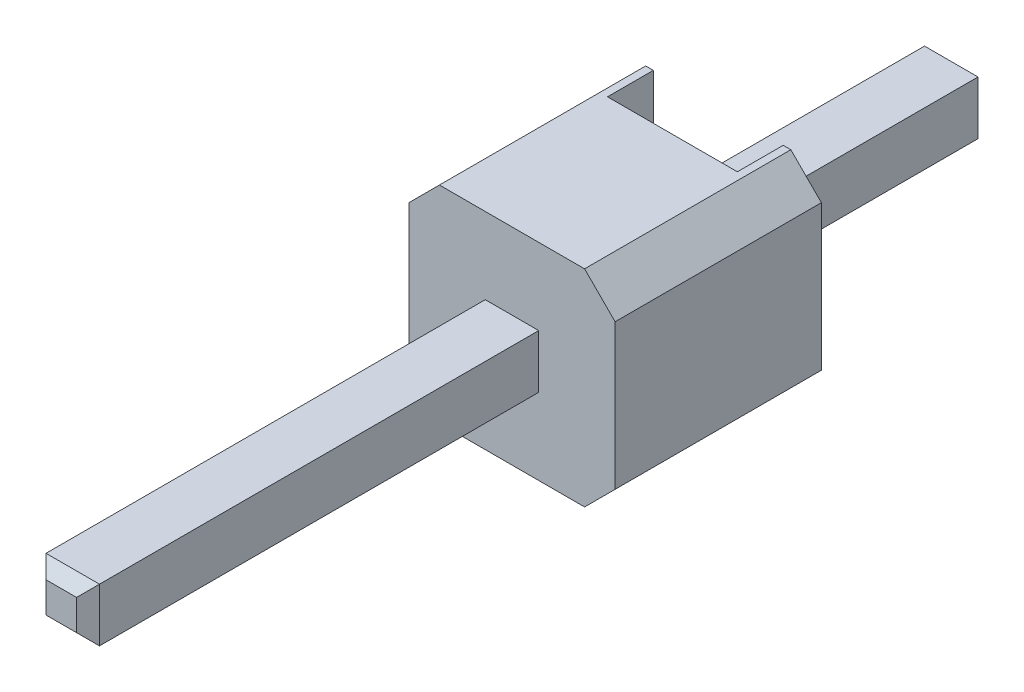
ISO-10303-21;
HEADER;
FILE_DESCRIPTION(('STEP AP214'),'2;1');
FILE_NAME('part.step','',(''),(''),'','','');
FILE_SCHEMA(('AUTOMOTIVE_DESIGN { 1 0 10303 214 1 1 1 1 }'));
ENDSEC;
DATA;
#1=APPLICATION_CONTEXT('core data for automotive mechanical design processes');
#2=APPLICATION_PROTOCOL_DEFINITION('international standard','automotive_design',2000,#1);
#3=PRODUCT_CONTEXT('',#1,'mechanical');
#4=PRODUCT('Part','Part','',(#3));
#5=PRODUCT_RELATED_PRODUCT_CATEGORY('part','',(#4));
#6=PRODUCT_DEFINITION_FORMATION('','',#4);
#7=PRODUCT_DEFINITION_CONTEXT('part definition',#1,'design');
#8=PRODUCT_DEFINITION('design','',#6,#7);
#9=PRODUCT_DEFINITION_SHAPE('','',#8);
#10=(LENGTH_UNIT() NAMED_UNIT(*) SI_UNIT(.MILLI.,.METRE.));
#11=(NAMED_UNIT(*) PLANE_ANGLE_UNIT() SI_UNIT($,.RADIAN.));
#12=(NAMED_UNIT(*) SI_UNIT($,.STERADIAN.) SOLID_ANGLE_UNIT());
#13=UNCERTAINTY_MEASURE_WITH_UNIT(LENGTH_MEASURE(1.E-05),#10,'distance_accuracy_value','');
#14=(GEOMETRIC_REPRESENTATION_CONTEXT(3) GLOBAL_UNCERTAINTY_ASSIGNED_CONTEXT((#13)) GLOBAL_UNIT_ASSIGNED_CONTEXT((#10,
#11,#12)) REPRESENTATION_CONTEXT('',''));
#15=CARTESIAN_POINT('',(0.,0.,0.));
#16=DIRECTION('',(0.,0.,1.));
#17=DIRECTION('',(1.,0.,0.));
#18=AXIS2_PLACEMENT_3D('',#15,#16,#17);
#19=CARTESIAN_POINT('',(-0.349999999999997,-0.35,-3.05));
#20=DIRECTION('',(0.,0.707106781186547,0.707106781186549));
#21=DIRECTION('',(0.,-0.707106781186549,0.707106781186547));
#22=AXIS2_PLACEMENT_3D('',#19,#20,#21);
#23=PLANE('',#22);
#24=DIRECTION('',(1.,0.,0.));
#25=VECTOR('',#24,1.);
#26=CARTESIAN_POINT('',(-0.349999999999997,-0.35,-3.05));
#27=LINE('',#26,#25);
#28=CARTESIAN_POINT('',(0.350000000000003,-0.35,-3.05));
#29=VERTEX_POINT('',#28);
#30=CARTESIAN_POINT('',(-0.349999999999997,-0.35,-3.05));
#31=VERTEX_POINT('',#30);
#32=EDGE_CURVE('E176',#29,#31,#27,.F.);
#33=ORIENTED_EDGE('',*,*,#32,.T.);
#34=DIRECTION('',(0.577350269189627,0.577350269189625,-0.577350269189625));
#35=VECTOR('',#34,1.);
#36=CARTESIAN_POINT('',(-0.349999999999997,-0.35,-3.05));
#37=LINE('',#36,#35);
#38=CARTESIAN_POINT('',(-0.199999999999997,-0.2,-3.2));
#39=VERTEX_POINT('',#38);
#40=EDGE_CURVE('E17',#31,#39,#37,.T.);
#41=ORIENTED_EDGE('',*,*,#40,.T.);
#42=DIRECTION('',(1.,0.,0.));
#43=VECTOR('',#42,1.);
#44=CARTESIAN_POINT('',(-0.349999999999997,-0.2,-3.2));
#45=LINE('',#44,#43);
#46=CARTESIAN_POINT('',(0.200000000000003,-0.2,-3.2));
#47=VERTEX_POINT('',#46);
#48=EDGE_CURVE('E171',#39,#47,#45,.T.);
#49=ORIENTED_EDGE('',*,*,#48,.T.);
#50=DIRECTION('',(0.577350269189627,-0.577350269189625,0.577350269189625));
#51=VECTOR('',#50,1.);
#52=CARTESIAN_POINT('',(0.200000000000003,-0.2,-3.2));
#53=LINE('',#52,#51);
#54=EDGE_CURVE('E192',#47,#29,#53,.T.);
#55=ORIENTED_EDGE('',*,*,#54,.T.);
#56=EDGE_LOOP('',(#33,#41,#49,#55));
#57=FACE_BOUND('',#56,.T.);
#58=ADVANCED_FACE('F14',(#57),#23,.F.);
#59=CARTESIAN_POINT('',(-0.349999999999997,0.35,-3.05));
#60=DIRECTION('',(0.707106781186546,0.,0.707106781186549));
#61=DIRECTION('',(0.707106781186549,0.,-0.707106781186546));
#62=AXIS2_PLACEMENT_3D('',#59,#60,#61);
#63=PLANE('',#62);
#64=DIRECTION('',(0.,1.,0.));
#65=VECTOR('',#64,1.);
#66=CARTESIAN_POINT('',(-0.199999999999997,0.35,-3.2));
#67=LINE('',#66,#65);
#68=CARTESIAN_POINT('',(-0.199999999999997,0.2,-3.2));
#69=VERTEX_POINT('',#68);
#70=EDGE_CURVE('E180',#69,#39,#67,.F.);
#71=ORIENTED_EDGE('',*,*,#70,.T.);
#72=ORIENTED_EDGE('',*,*,#40,.F.);
#73=DIRECTION('',(0.,1.,0.));
#74=VECTOR('',#73,1.);
#75=CARTESIAN_POINT('',(-0.349999999999997,0.35,-3.05));
#76=LINE('',#75,#74);
#77=CARTESIAN_POINT('',(-0.349999999999997,0.35,-3.05));
#78=VERTEX_POINT('',#77);
#79=EDGE_CURVE('E203',#31,#78,#76,.T.);
#80=ORIENTED_EDGE('',*,*,#79,.T.);
#81=DIRECTION('',(0.577350269189625,-0.577350269189627,-0.577350269189625));
#82=VECTOR('',#81,1.);
#83=CARTESIAN_POINT('',(-0.349999999999997,0.35,-3.05));
#84=LINE('',#83,#82);
#85=EDGE_CURVE('E184',#78,#69,#84,.T.);
#86=ORIENTED_EDGE('',*,*,#85,.T.);
#87=EDGE_LOOP('',(#71,#72,#80,#86));
#88=FACE_BOUND('',#87,.T.);
#89=ADVANCED_FACE('F182',(#88),#63,.F.);
#90=CARTESIAN_POINT('',(-0.349999999999997,0.35,-3.2));
#91=DIRECTION('',(0.,0.,1.));
#92=DIRECTION('',(1.,0.,0.));
#93=AXIS2_PLACEMENT_3D('',#90,#91,#92);
#94=PLANE('',#93);
#95=ORIENTED_EDGE('',*,*,#70,.F.);
#96=DIRECTION('',(1.,0.,0.));
#97=VECTOR('',#96,1.);
#98=CARTESIAN_POINT('',(-0.349999999999997,0.199999999999999,-3.2));
#99=LINE('',#98,#97);
#100=CARTESIAN_POINT('',(0.200000000000003,0.2,-3.2));
#101=VERTEX_POINT('',#100);
#102=EDGE_CURVE('E206',#69,#101,#99,.T.);
#103=ORIENTED_EDGE('',*,*,#102,.T.);
#104=DIRECTION('',(0.,1.,0.));
#105=VECTOR('',#104,1.);
#106=CARTESIAN_POINT('',(0.200000000000003,-0.35,-3.2));
#107=LINE('',#106,#105);
#108=EDGE_CURVE('E189',#101,#47,#107,.F.);
#109=ORIENTED_EDGE('',*,*,#108,.T.);
#110=ORIENTED_EDGE('',*,*,#48,.F.);
#111=EDGE_LOOP('',(#95,#103,#109,#110));
#112=FACE_BOUND('',#111,.T.);
#113=ADVANCED_FACE('F187',(#112),#94,.F.);
#114=CARTESIAN_POINT('',(0.350000000000003,-0.35,-3.05));
#115=DIRECTION('',(-0.707106781186547,0.,0.707106781186549));
#116=DIRECTION('',(0.707106781186549,0.,0.707106781186547));
#117=AXIS2_PLACEMENT_3D('',#114,#115,#116);
#118=PLANE('',#117);
#119=ORIENTED_EDGE('',*,*,#108,.F.);
#120=DIRECTION('',(0.577350269189625,0.577350269189627,0.577350269189625));
#121=VECTOR('',#120,1.);
#122=CARTESIAN_POINT('',(0.200000000000003,0.199999999999999,-3.2));
#123=LINE('',#122,#121);
#124=CARTESIAN_POINT('',(0.350000000000003,0.35,-3.05));
#125=VERTEX_POINT('',#124);
#126=EDGE_CURVE('E208',#101,#125,#123,.T.);
#127=ORIENTED_EDGE('',*,*,#126,.T.);
#128=DIRECTION('',(0.,1.,0.));
#129=VECTOR('',#128,1.);
#130=CARTESIAN_POINT('',(0.350000000000003,-0.35,-3.05));
#131=LINE('',#130,#129);
#132=EDGE_CURVE('E212',#125,#29,#131,.F.);
#133=ORIENTED_EDGE('',*,*,#132,.T.);
#134=ORIENTED_EDGE('',*,*,#54,.F.);
#135=EDGE_LOOP('',(#119,#127,#133,#134));
#136=FACE_BOUND('',#135,.T.);
#137=ADVANCED_FACE('F507',(#136),#118,.F.);
#138=CARTESIAN_POINT('',(-0.349999999999997,-0.35,8.6));
#139=DIRECTION('',(0.,1.,0.));
#140=DIRECTION('',(0.,0.,1.));
#141=AXIS2_PLACEMENT_3D('',#138,#139,#140);
#142=PLANE('',#141);
#143=ORIENTED_EDGE('',*,*,#32,.F.);
#144=DIRECTION('',(0.,0.,1.));
#145=VECTOR('',#144,1.);
#146=CARTESIAN_POINT('',(0.350000000000003,-0.35,8.6));
#147=LINE('',#146,#145);
#148=CARTESIAN_POINT('',(0.350000000000003,-0.35,0.6));
#149=VERTEX_POINT('',#148);
#150=EDGE_CURVE('E215',#29,#149,#147,.T.);
#151=ORIENTED_EDGE('',*,*,#150,.T.);
#152=DIRECTION('',(1.,0.,0.));
#153=VECTOR('',#152,1.);
#154=CARTESIAN_POINT('',(-0.349999999999997,-0.35,0.6));
#155=LINE('',#154,#153);
#156=CARTESIAN_POINT('',(-0.349999999999997,-0.35,0.6));
#157=VERTEX_POINT('',#156);
#158=EDGE_CURVE('E196',#157,#149,#155,.T.);
#159=ORIENTED_EDGE('',*,*,#158,.F.);
#160=DIRECTION('',(0.,0.,-1.));
#161=VECTOR('',#160,1.);
#162=CARTESIAN_POINT('',(-0.349999999999997,-0.35,8.6));
#163=LINE('',#162,#161);
#164=EDGE_CURVE('E201',#157,#31,#163,.T.);
#165=ORIENTED_EDGE('',*,*,#164,.T.);
#166=EDGE_LOOP('',(#143,#151,#159,#165));
#167=FACE_BOUND('',#166,.T.);
#168=ADVANCED_FACE('F503',(#167),#142,.F.);
#169=CARTESIAN_POINT('',(-0.349999999999997,0.35,8.6));
#170=DIRECTION('',(1.,0.,0.));
#171=DIRECTION('',(0.,0.,-1.));
#172=AXIS2_PLACEMENT_3D('',#169,#170,#171);
#173=PLANE('',#172);
#174=ORIENTED_EDGE('',*,*,#79,.F.);
#175=ORIENTED_EDGE('',*,*,#164,.F.);
#176=DIRECTION('',(0.,1.,0.));
#177=VECTOR('',#176,1.);
#178=CARTESIAN_POINT('',(-0.349999999999997,0.35,0.6));
#179=LINE('',#178,#177);
#180=CARTESIAN_POINT('',(-0.349999999999997,0.35,0.6));
#181=VERTEX_POINT('',#180);
#182=EDGE_CURVE('E199',#181,#157,#179,.F.);
#183=ORIENTED_EDGE('',*,*,#182,.F.);
#184=DIRECTION('',(0.,0.,-1.));
#185=VECTOR('',#184,1.);
#186=CARTESIAN_POINT('',(-0.349999999999997,0.35,8.6));
#187=LINE('',#186,#185);
#188=EDGE_CURVE('E218',#181,#78,#187,.T.);
#189=ORIENTED_EDGE('',*,*,#188,.T.);
#190=EDGE_LOOP('',(#174,#175,#183,#189));
#191=FACE_BOUND('',#190,.T.);
#192=ADVANCED_FACE('F499',(#191),#173,.F.);
#193=CARTESIAN_POINT('',(-0.349999999999997,0.35,-3.05));
#194=DIRECTION('',(0.,-0.707106781186546,0.707106781186549));
#195=DIRECTION('',(0.,-0.707106781186549,-0.707106781186546));
#196=AXIS2_PLACEMENT_3D('',#193,#194,#195);
#197=PLANE('',#196);
#198=ORIENTED_EDGE('',*,*,#102,.F.);
#199=ORIENTED_EDGE('',*,*,#85,.F.);
#200=DIRECTION('',(1.,0.,0.));
#201=VECTOR('',#200,1.);
#202=CARTESIAN_POINT('',(-0.349999999999997,0.35,-3.05));
#203=LINE('',#202,#201);
#204=EDGE_CURVE('E221',#78,#125,#203,.T.);
#205=ORIENTED_EDGE('',*,*,#204,.T.);
#206=ORIENTED_EDGE('',*,*,#126,.F.);
#207=EDGE_LOOP('',(#198,#199,#205,#206));
#208=FACE_BOUND('',#207,.T.);
#209=ADVANCED_FACE('F495',(#208),#197,.F.);
#210=CARTESIAN_POINT('',(0.350000000000003,-0.35,8.6));
#211=DIRECTION('',(-1.,0.,0.));
#212=DIRECTION('',(0.,0.,1.));
#213=AXIS2_PLACEMENT_3D('',#210,#211,#212);
#214=PLANE('',#213);
#215=ORIENTED_EDGE('',*,*,#132,.F.);
#216=DIRECTION('',(0.,0.,-1.));
#217=VECTOR('',#216,1.);
#218=CARTESIAN_POINT('',(0.350000000000003,0.35,8.6));
#219=LINE('',#218,#217);
#220=CARTESIAN_POINT('',(0.350000000000003,0.35,0.6));
#221=VERTEX_POINT('',#220);
#222=EDGE_CURVE('E224',#125,#221,#219,.F.);
#223=ORIENTED_EDGE('',*,*,#222,.T.);
#224=DIRECTION('',(0.,1.,0.));
#225=VECTOR('',#224,1.);
#226=CARTESIAN_POINT('',(0.350000000000003,-0.35,0.6));
#227=LINE('',#226,#225);
#228=EDGE_CURVE('E210',#149,#221,#227,.T.);
#229=ORIENTED_EDGE('',*,*,#228,.F.);
#230=ORIENTED_EDGE('',*,*,#150,.F.);
#231=EDGE_LOOP('',(#215,#223,#229,#230));
#232=FACE_BOUND('',#231,.T.);
#233=ADVANCED_FACE('F491',(#232),#214,.F.);
#234=CARTESIAN_POINT('',(-0.349999999999997,0.35,8.6));
#235=DIRECTION('',(0.,-1.,0.));
#236=DIRECTION('',(0.,0.,-1.));
#237=AXIS2_PLACEMENT_3D('',#234,#235,#236);
#238=PLANE('',#237);
#239=ORIENTED_EDGE('',*,*,#204,.F.);
#240=ORIENTED_EDGE('',*,*,#188,.F.);
#241=DIRECTION('',(1.,0.,0.));
#242=VECTOR('',#241,1.);
#243=CARTESIAN_POINT('',(0.850000000000004,0.35,0.6));
#244=LINE('',#243,#242);
#245=EDGE_CURVE('E231',#181,#221,#244,.T.);
#246=ORIENTED_EDGE('',*,*,#245,.T.);
#247=ORIENTED_EDGE('',*,*,#222,.F.);
#248=EDGE_LOOP('',(#239,#240,#246,#247));
#249=FACE_BOUND('',#248,.T.);
#250=ADVANCED_FACE('F484',(#249),#238,.F.);
#251=CARTESIAN_POINT('',(0.850000000000004,1.35,0.6));
#252=DIRECTION('',(0.,0.,1.));
#253=DIRECTION('',(1.,0.,0.));
#254=AXIS2_PLACEMENT_3D('',#251,#252,#253);
#255=PLANE('',#254);
#256=ORIENTED_EDGE('',*,*,#182,.T.);
#257=ORIENTED_EDGE('',*,*,#158,.T.);
#258=ORIENTED_EDGE('',*,*,#228,.T.);
#259=ORIENTED_EDGE('',*,*,#245,.F.);
#260=EDGE_LOOP('',(#256,#257,#258,#259));
#261=FACE_BOUND('',#260,.T.);
#262=DIRECTION('',(1.,0.,0.));
#263=VECTOR('',#262,1.);
#264=CARTESIAN_POINT('',(0.850000000000004,-1.35,0.6));
#265=LINE('',#264,#263);
#266=CARTESIAN_POINT('',(-0.849999999999997,-1.35,0.6));
#267=VERTEX_POINT('',#266);
#268=CARTESIAN_POINT('',(0.850000000000004,-1.35,0.6));
#269=VERTEX_POINT('',#268);
#270=EDGE_CURVE('E229',#267,#269,#265,.T.);
#271=ORIENTED_EDGE('',*,*,#270,.F.);
#272=DIRECTION('',(0.,1.,0.));
#273=VECTOR('',#272,1.);
#274=CARTESIAN_POINT('',(-0.849999999999997,1.35,0.6));
#275=LINE('',#274,#273);
#276=CARTESIAN_POINT('',(-0.849999999999997,1.35,0.6));
#277=VERTEX_POINT('',#276);
#278=EDGE_CURVE('E246',#277,#267,#275,.F.);
#279=ORIENTED_EDGE('',*,*,#278,.F.);
#280=DIRECTION('',(1.,0.,0.));
#281=VECTOR('',#280,1.);
#282=CARTESIAN_POINT('',(0.850000000000004,1.35,0.6));
#283=LINE('',#282,#281);
#284=CARTESIAN_POINT('',(0.850000000000004,1.35,0.6));
#285=VERTEX_POINT('',#284);
#286=EDGE_CURVE('E227',#285,#277,#283,.F.);
#287=ORIENTED_EDGE('',*,*,#286,.F.);
#288=DIRECTION('',(0.,1.,0.));
#289=VECTOR('',#288,1.);
#290=CARTESIAN_POINT('',(0.850000000000004,1.35,0.6));
#291=LINE('',#290,#289);
#292=EDGE_CURVE('E237',#269,#285,#291,.T.);
#293=ORIENTED_EDGE('',*,*,#292,.F.);
#294=EDGE_LOOP('',(#271,#279,#287,#293));
#295=FACE_BOUND('',#294,.T.);
#296=ADVANCED_FACE('F475',(#261,#295),#255,.F.);
#297=CARTESIAN_POINT('',(-0.349999999999997,0.2,8.6));
#298=DIRECTION('',(0.,0.707106781186549,0.707106781186546));
#299=DIRECTION('',(0.,-0.707106781186546,0.707106781186549));
#300=AXIS2_PLACEMENT_3D('',#297,#298,#299);
#301=PLANE('',#300);
#302=DIRECTION('',(-0.577350269189625,0.577350269189625,-0.577350269189628));
#303=VECTOR('',#302,1.);
#304=CARTESIAN_POINT('',(-0.199999999999997,0.2,8.6));
#305=LINE('',#304,#303);
#306=CARTESIAN_POINT('',(-0.199999999999997,0.2,8.6));
#307=VERTEX_POINT('',#306);
#308=CARTESIAN_POINT('',(-0.349999999999997,0.35,8.45));
#309=VERTEX_POINT('',#308);
#310=EDGE_CURVE('E251',#307,#309,#305,.T.);
#311=ORIENTED_EDGE('',*,*,#310,.F.);
#312=DIRECTION('',(1.,0.,0.));
#313=VECTOR('',#312,1.);
#314=CARTESIAN_POINT('',(-0.349999999999997,0.2,8.6));
#315=LINE('',#314,#313);
#316=CARTESIAN_POINT('',(0.200000000000003,0.2,8.6));
#317=VERTEX_POINT('',#316);
#318=EDGE_CURVE('E257',#317,#307,#315,.F.);
#319=ORIENTED_EDGE('',*,*,#318,.F.);
#320=DIRECTION('',(-0.577350269189624,-0.577350269189625,0.577350269189628));
#321=VECTOR('',#320,1.);
#322=CARTESIAN_POINT('',(0.350000000000003,0.35,8.45));
#323=LINE('',#322,#321);
#324=CARTESIAN_POINT('',(0.350000000000003,0.35,8.45));
#325=VERTEX_POINT('',#324);
#326=EDGE_CURVE('E260',#325,#317,#323,.T.);
#327=ORIENTED_EDGE('',*,*,#326,.F.);
#328=DIRECTION('',(1.,0.,0.));
#329=VECTOR('',#328,1.);
#330=CARTESIAN_POINT('',(-0.349999999999997,0.35,8.45));
#331=LINE('',#330,#329);
#332=EDGE_CURVE('E267',#325,#309,#331,.F.);
#333=ORIENTED_EDGE('',*,*,#332,.T.);
#334=EDGE_LOOP('',(#311,#319,#327,#333));
#335=FACE_BOUND('',#334,.T.);
#336=ADVANCED_FACE('F472',(#335),#301,.T.);
#337=CARTESIAN_POINT('',(0.850000000000004,1.35,0.6));
#338=DIRECTION('',(-1.,0.,0.));
#339=DIRECTION('',(0.,0.,1.));
#340=AXIS2_PLACEMENT_3D('',#337,#338,#339);
#341=PLANE('',#340);
#342=ORIENTED_EDGE('',*,*,#292,.T.);
#343=DIRECTION('',(0.,0.,1.));
#344=VECTOR('',#343,1.);
#345=CARTESIAN_POINT('',(0.850000000000004,1.35,0.6));
#346=LINE('',#345,#344);
#347=CARTESIAN_POINT('',(0.850000000000003,1.35,0.));
#348=VERTEX_POINT('',#347);
#349=EDGE_CURVE('E240',#285,#348,#346,.F.);
#350=ORIENTED_EDGE('',*,*,#349,.T.);
#351=DIRECTION('',(0.,1.,0.));
#352=VECTOR('',#351,1.);
#353=CARTESIAN_POINT('',(0.850000000000003,1.35,0.));
#354=LINE('',#353,#352);
#355=CARTESIAN_POINT('',(0.850000000000004,-1.35,0.));
#356=VERTEX_POINT('',#355);
#357=EDGE_CURVE('E271',#348,#356,#354,.F.);
#358=ORIENTED_EDGE('',*,*,#357,.T.);
#359=DIRECTION('',(0.,0.,1.));
#360=VECTOR('',#359,1.);
#361=CARTESIAN_POINT('',(0.850000000000004,-1.35,0.6));
#362=LINE('',#361,#360);
#363=EDGE_CURVE('E234',#356,#269,#362,.T.);
#364=ORIENTED_EDGE('',*,*,#363,.T.);
#365=EDGE_LOOP('',(#342,#350,#358,#364));
#366=FACE_BOUND('',#365,.T.);
#367=ADVANCED_FACE('F474',(#366),#341,.T.);
#368=CARTESIAN_POINT('',(-0.849999999999997,1.35,0.6));
#369=DIRECTION('',(1.,0.,0.));
#370=DIRECTION('',(0.,0.,-1.));
#371=AXIS2_PLACEMENT_3D('',#368,#369,#370);
#372=PLANE('',#371);
#373=ORIENTED_EDGE('',*,*,#278,.T.);
#374=DIRECTION('',(0.,0.,-1.));
#375=VECTOR('',#374,1.);
#376=CARTESIAN_POINT('',(-0.849999999999997,-1.35,0.6));
#377=LINE('',#376,#375);
#378=CARTESIAN_POINT('',(-0.849999999999997,-1.35,0.));
#379=VERTEX_POINT('',#378);
#380=EDGE_CURVE('E249',#267,#379,#377,.T.);
#381=ORIENTED_EDGE('',*,*,#380,.T.);
#382=DIRECTION('',(0.,1.,0.));
#383=VECTOR('',#382,1.);
#384=CARTESIAN_POINT('',(-0.849999999999997,1.35,0.));
#385=LINE('',#384,#383);
#386=CARTESIAN_POINT('',(-0.849999999999997,1.35,0.));
#387=VERTEX_POINT('',#386);
#388=EDGE_CURVE('E286',#379,#387,#385,.T.);
#389=ORIENTED_EDGE('',*,*,#388,.T.);
#390=DIRECTION('',(0.,0.,-1.));
#391=VECTOR('',#390,1.);
#392=CARTESIAN_POINT('',(-0.849999999999997,1.35,0.6));
#393=LINE('',#392,#391);
#394=EDGE_CURVE('E243',#387,#277,#393,.F.);
#395=ORIENTED_EDGE('',*,*,#394,.T.);
#396=EDGE_LOOP('',(#373,#381,#389,#395));
#397=FACE_BOUND('',#396,.T.);
#398=ADVANCED_FACE('F481',(#397),#372,.T.);
#399=CARTESIAN_POINT('',(-0.199999999999997,0.35,8.6));
#400=DIRECTION('',(-0.707106781186549,0.,0.707106781186546));
#401=DIRECTION('',(0.707106781186546,0.,0.707106781186549));
#402=AXIS2_PLACEMENT_3D('',#399,#400,#401);
#403=PLANE('',#402);
#404=DIRECTION('',(-0.577350269189625,-0.577350269189624,-0.577350269189628));
#405=VECTOR('',#404,1.);
#406=CARTESIAN_POINT('',(-0.199999999999997,-0.2,8.6));
#407=LINE('',#406,#405);
#408=CARTESIAN_POINT('',(-0.199999999999997,-0.2,8.6));
#409=VERTEX_POINT('',#408);
#410=CARTESIAN_POINT('',(-0.349999999999997,-0.35,8.45));
#411=VERTEX_POINT('',#410);
#412=EDGE_CURVE('E300',#409,#411,#407,.T.);
#413=ORIENTED_EDGE('',*,*,#412,.F.);
#414=DIRECTION('',(0.,1.,0.));
#415=VECTOR('',#414,1.);
#416=CARTESIAN_POINT('',(-0.199999999999997,0.35,8.6));
#417=LINE('',#416,#415);
#418=EDGE_CURVE('E254',#307,#409,#417,.F.);
#419=ORIENTED_EDGE('',*,*,#418,.F.);
#420=ORIENTED_EDGE('',*,*,#310,.T.);
#421=DIRECTION('',(0.,1.,0.));
#422=VECTOR('',#421,1.);
#423=CARTESIAN_POINT('',(-0.349999999999997,0.35,8.45));
#424=LINE('',#423,#422);
#425=EDGE_CURVE('E298',#309,#411,#424,.F.);
#426=ORIENTED_EDGE('',*,*,#425,.T.);
#427=EDGE_LOOP('',(#413,#419,#420,#426));
#428=FACE_BOUND('',#427,.T.);
#429=ADVANCED_FACE('F461',(#428),#403,.T.);
#430=CARTESIAN_POINT('',(-0.349999999999997,0.35,8.6));
#431=DIRECTION('',(0.,0.,1.));
#432=DIRECTION('',(1.,0.,0.));
#433=AXIS2_PLACEMENT_3D('',#430,#431,#432);
#434=PLANE('',#433);
#435=DIRECTION('',(0.,1.,0.));
#436=VECTOR('',#435,1.);
#437=CARTESIAN_POINT('',(0.200000000000003,0.35,8.6));
#438=LINE('',#437,#436);
#439=CARTESIAN_POINT('',(0.200000000000003,-0.2,8.6));
#440=VERTEX_POINT('',#439);
#441=EDGE_CURVE('E263',#317,#440,#438,.F.);
#442=ORIENTED_EDGE('',*,*,#441,.F.);
#443=ORIENTED_EDGE('',*,*,#318,.T.);
#444=ORIENTED_EDGE('',*,*,#418,.T.);
#445=DIRECTION('',(1.,0.,0.));
#446=VECTOR('',#445,1.);
#447=CARTESIAN_POINT('',(-0.349999999999997,-0.2,8.6));
#448=LINE('',#447,#446);
#449=EDGE_CURVE('E306',#440,#409,#448,.F.);
#450=ORIENTED_EDGE('',*,*,#449,.F.);
#451=EDGE_LOOP('',(#442,#443,#444,#450));
#452=FACE_BOUND('',#451,.T.);
#453=ADVANCED_FACE('F458',(#452),#434,.T.);
#454=CARTESIAN_POINT('',(0.200000000000003,0.35,8.6));
#455=DIRECTION('',(0.70710678118655,0.,0.707106781186545));
#456=DIRECTION('',(0.707106781186545,0.,-0.70710678118655));
#457=AXIS2_PLACEMENT_3D('',#454,#455,#456);
#458=PLANE('',#457);
#459=DIRECTION('',(-0.577350269189625,0.577350269189624,0.577350269189628));
#460=VECTOR('',#459,1.);
#461=CARTESIAN_POINT('',(0.350000000000003,-0.35,8.45));
#462=LINE('',#461,#460);
#463=CARTESIAN_POINT('',(0.350000000000003,-0.35,8.45));
#464=VERTEX_POINT('',#463);
#465=EDGE_CURVE('E303',#464,#440,#462,.T.);
#466=ORIENTED_EDGE('',*,*,#465,.F.);
#467=DIRECTION('',(0.,1.,0.));
#468=VECTOR('',#467,1.);
#469=CARTESIAN_POINT('',(0.350000000000003,-0.35,8.45));
#470=LINE('',#469,#468);
#471=EDGE_CURVE('E310',#464,#325,#470,.T.);
#472=ORIENTED_EDGE('',*,*,#471,.T.);
#473=ORIENTED_EDGE('',*,*,#326,.T.);
#474=ORIENTED_EDGE('',*,*,#441,.T.);
#475=EDGE_LOOP('',(#466,#472,#473,#474));
#476=FACE_BOUND('',#475,.T.);
#477=ADVANCED_FACE('F454',(#476),#458,.T.);
#478=CARTESIAN_POINT('',(-0.349999999999997,0.35,8.6));
#479=DIRECTION('',(0.,-1.,0.));
#480=DIRECTION('',(0.,0.,-1.));
#481=AXIS2_PLACEMENT_3D('',#478,#479,#480);
#482=PLANE('',#481);
#483=ORIENTED_EDGE('',*,*,#332,.F.);
#484=DIRECTION('',(0.,0.,1.));
#485=VECTOR('',#484,1.);
#486=CARTESIAN_POINT('',(0.350000000000003,0.35,8.6));
#487=LINE('',#486,#485);
#488=CARTESIAN_POINT('',(0.350000000000003,0.35,2.7));
#489=VERTEX_POINT('',#488);
#490=EDGE_CURVE('E313',#325,#489,#487,.F.);
#491=ORIENTED_EDGE('',*,*,#490,.T.);
#492=DIRECTION('',(1.,0.,0.));
#493=VECTOR('',#492,1.);
#494=CARTESIAN_POINT('',(-0.349999999999997,0.35,2.7));
#495=LINE('',#494,#493);
#496=CARTESIAN_POINT('',(-0.349999999999997,0.35,2.7));
#497=VERTEX_POINT('',#496);
#498=EDGE_CURVE('E265',#497,#489,#495,.T.);
#499=ORIENTED_EDGE('',*,*,#498,.F.);
#500=DIRECTION('',(0.,0.,-1.));
#501=VECTOR('',#500,1.);
#502=CARTESIAN_POINT('',(-0.349999999999997,0.35,8.6));
#503=LINE('',#502,#501);
#504=EDGE_CURVE('E295',#497,#309,#503,.F.);
#505=ORIENTED_EDGE('',*,*,#504,.T.);
#506=EDGE_LOOP('',(#483,#491,#499,#505));
#507=FACE_BOUND('',#506,.T.);
#508=ADVANCED_FACE('F469',(#507),#482,.F.);
#509=CARTESIAN_POINT('',(1.35,1.35,0.));
#510=DIRECTION('',(0.,0.,1.));
#511=DIRECTION('',(1.,0.,0.));
#512=AXIS2_PLACEMENT_3D('',#509,#510,#511);
#513=PLANE('',#512);
#514=DIRECTION('',(-0.707106781186548,-0.707106781186548,0.));
#515=VECTOR('',#514,1.);
#516=CARTESIAN_POINT('',(1.35,-0.95,0.));
#517=LINE('',#516,#515);
#518=CARTESIAN_POINT('',(1.35,-0.949999999999999,0.));
#519=VERTEX_POINT('',#518);
#520=CARTESIAN_POINT('',(0.950000000000002,-1.35,0.));
#521=VERTEX_POINT('',#520);
#522=EDGE_CURVE('E274',#519,#521,#517,.T.);
#523=ORIENTED_EDGE('',*,*,#522,.T.);
#524=DIRECTION('',(1.,0.,0.));
#525=VECTOR('',#524,1.);
#526=CARTESIAN_POINT('',(-1.35,-1.35,0.));
#527=LINE('',#526,#525);
#528=EDGE_CURVE('E325',#521,#356,#527,.F.);
#529=ORIENTED_EDGE('',*,*,#528,.T.);
#530=ORIENTED_EDGE('',*,*,#357,.F.);
#531=DIRECTION('',(1.,0.,0.));
#532=VECTOR('',#531,1.);
#533=CARTESIAN_POINT('',(1.35,1.35,0.));
#534=LINE('',#533,#532);
#535=CARTESIAN_POINT('',(0.950000000000004,1.35,0.));
#536=VERTEX_POINT('',#535);
#537=EDGE_CURVE('E269',#536,#348,#534,.F.);
#538=ORIENTED_EDGE('',*,*,#537,.F.);
#539=DIRECTION('',(0.707106781186548,-0.707106781186548,0.));
#540=VECTOR('',#539,1.);
#541=CARTESIAN_POINT('',(0.950000000000004,1.35,0.));
#542=LINE('',#541,#540);
#543=CARTESIAN_POINT('',(1.35,0.950000000000001,0.));
#544=VERTEX_POINT('',#543);
#545=EDGE_CURVE('E278',#536,#544,#542,.T.);
#546=ORIENTED_EDGE('',*,*,#545,.T.);
#547=DIRECTION('',(0.,1.,0.));
#548=VECTOR('',#547,1.);
#549=CARTESIAN_POINT('',(1.35,1.35,0.));
#550=LINE('',#549,#548);
#551=EDGE_CURVE('E331',#544,#519,#550,.F.);
#552=ORIENTED_EDGE('',*,*,#551,.T.);
#553=EDGE_LOOP('',(#523,#529,#530,#538,#546,#552));
#554=FACE_BOUND('',#553,.T.);
#555=ADVANCED_FACE('F627',(#554),#513,.F.);
#556=CARTESIAN_POINT('',(1.35,-0.95,2.7));
#557=DIRECTION('',(-0.707106781186548,0.707106781186548,0.));
#558=DIRECTION('',(-0.707106781186548,-0.707106781186548,0.));
#559=AXIS2_PLACEMENT_3D('',#556,#557,#558);
#560=PLANE('',#559);
#561=DIRECTION('',(0.,0.,1.));
#562=VECTOR('',#561,1.);
#563=CARTESIAN_POINT('',(0.950000000000002,-1.35,2.7));
#564=LINE('',#563,#562);
#565=CARTESIAN_POINT('',(0.950000000000002,-1.35,2.7));
#566=VERTEX_POINT('',#565);
#567=EDGE_CURVE('E322',#566,#521,#564,.F.);
#568=ORIENTED_EDGE('',*,*,#567,.T.);
#569=ORIENTED_EDGE('',*,*,#522,.F.);
#570=DIRECTION('',(0.,0.,1.));
#571=VECTOR('',#570,1.);
#572=CARTESIAN_POINT('',(1.35,-0.949999999999999,2.7));
#573=LINE('',#572,#571);
#574=CARTESIAN_POINT('',(1.35,-0.949999999999999,2.7));
#575=VERTEX_POINT('',#574);
#576=EDGE_CURVE('E333',#519,#575,#573,.T.);
#577=ORIENTED_EDGE('',*,*,#576,.T.);
#578=DIRECTION('',(-0.707106781186548,-0.707106781186548,0.));
#579=VECTOR('',#578,1.);
#580=CARTESIAN_POINT('',(1.35,-0.95,2.7));
#581=LINE('',#580,#579);
#582=EDGE_CURVE('E276',#566,#575,#581,.F.);
#583=ORIENTED_EDGE('',*,*,#582,.F.);
#584=EDGE_LOOP('',(#568,#569,#577,#583));
#585=FACE_BOUND('',#584,.T.);
#586=ADVANCED_FACE('F397',(#585),#560,.F.);
#587=CARTESIAN_POINT('',(0.950000000000004,1.35,2.7));
#588=DIRECTION('',(-0.707106781186548,-0.707106781186548,0.));
#589=DIRECTION('',(0.707106781186548,-0.707106781186548,0.));
#590=AXIS2_PLACEMENT_3D('',#587,#588,#589);
#591=PLANE('',#590);
#592=DIRECTION('',(0.,0.,1.));
#593=VECTOR('',#592,1.);
#594=CARTESIAN_POINT('',(1.35,0.95,2.7));
#595=LINE('',#594,#593);
#596=CARTESIAN_POINT('',(1.35,0.950000000000001,2.7));
#597=VERTEX_POINT('',#596);
#598=EDGE_CURVE('E328',#597,#544,#595,.F.);
#599=ORIENTED_EDGE('',*,*,#598,.T.);
#600=ORIENTED_EDGE('',*,*,#545,.F.);
#601=DIRECTION('',(0.,0.,-1.));
#602=VECTOR('',#601,1.);
#603=CARTESIAN_POINT('',(0.950000000000004,1.35,2.7));
#604=LINE('',#603,#602);
#605=CARTESIAN_POINT('',(0.950000000000004,1.35,2.7));
#606=VERTEX_POINT('',#605);
#607=EDGE_CURVE('E342',#536,#606,#604,.F.);
#608=ORIENTED_EDGE('',*,*,#607,.T.);
#609=DIRECTION('',(0.707106781186548,-0.707106781186548,0.));
#610=VECTOR('',#609,1.);
#611=CARTESIAN_POINT('',(0.950000000000004,1.35,2.7));
#612=LINE('',#611,#610);
#613=EDGE_CURVE('E280',#597,#606,#612,.F.);
#614=ORIENTED_EDGE('',*,*,#613,.F.);
#615=EDGE_LOOP('',(#599,#600,#608,#614));
#616=FACE_BOUND('',#615,.T.);
#617=ADVANCED_FACE('F404',(#616),#591,.F.);
#618=CARTESIAN_POINT('',(-0.949999999999996,-1.35,2.7));
#619=DIRECTION('',(0.707106781186548,0.707106781186547,0.));
#620=DIRECTION('',(-0.707106781186547,0.707106781186548,0.));
#621=AXIS2_PLACEMENT_3D('',#618,#619,#620);
#622=PLANE('',#621);
#623=DIRECTION('',(0.,0.,-1.));
#624=VECTOR('',#623,1.);
#625=CARTESIAN_POINT('',(-1.35,-0.95,2.7));
#626=LINE('',#625,#624);
#627=CARTESIAN_POINT('',(-1.35,-0.949999999999999,2.7));
#628=VERTEX_POINT('',#627);
#629=CARTESIAN_POINT('',(-1.35,-0.949999999999999,0.));
#630=VERTEX_POINT('',#629);
#631=EDGE_CURVE('E345',#628,#630,#626,.T.);
#632=ORIENTED_EDGE('',*,*,#631,.T.);
#633=DIRECTION('',(0.707106781186551,-0.707106781186544,0.));
#634=VECTOR('',#633,1.);
#635=CARTESIAN_POINT('',(-1.35,-0.95,0.));
#636=LINE('',#635,#634);
#637=CARTESIAN_POINT('',(-0.949999999999996,-1.35,0.));
#638=VERTEX_POINT('',#637);
#639=EDGE_CURVE('E284',#630,#638,#636,.T.);
#640=ORIENTED_EDGE('',*,*,#639,.T.);
#641=DIRECTION('',(0.,0.,1.));
#642=VECTOR('',#641,1.);
#643=CARTESIAN_POINT('',(-0.949999999999996,-1.35,2.7));
#644=LINE('',#643,#642);
#645=CARTESIAN_POINT('',(-0.949999999999996,-1.35,2.7));
#646=VERTEX_POINT('',#645);
#647=EDGE_CURVE('E319',#638,#646,#644,.T.);
#648=ORIENTED_EDGE('',*,*,#647,.T.);
#649=DIRECTION('',(-0.707106781186547,0.707106781186548,0.));
#650=VECTOR('',#649,1.);
#651=CARTESIAN_POINT('',(-0.949999999999996,-1.35,2.7));
#652=LINE('',#651,#650);
#653=EDGE_CURVE('E282',#628,#646,#652,.F.);
#654=ORIENTED_EDGE('',*,*,#653,.F.);
#655=EDGE_LOOP('',(#632,#640,#648,#654));
#656=FACE_BOUND('',#655,.T.);
#657=ADVANCED_FACE('F380',(#656),#622,.F.);
#658=CARTESIAN_POINT('',(1.35,1.35,0.));
#659=DIRECTION('',(0.,0.,1.));
#660=DIRECTION('',(1.,0.,0.));
#661=AXIS2_PLACEMENT_3D('',#658,#659,#660);
#662=PLANE('',#661);
#663=DIRECTION('',(0.707106781186548,0.707106781186547,0.));
#664=VECTOR('',#663,1.);
#665=CARTESIAN_POINT('',(-1.35,0.95,0.));
#666=LINE('',#665,#664);
#667=CARTESIAN_POINT('',(-1.35,0.95,0.));
#668=VERTEX_POINT('',#667);
#669=CARTESIAN_POINT('',(-0.949999999999997,1.35,0.));
#670=VERTEX_POINT('',#669);
#671=EDGE_CURVE('E289',#668,#670,#666,.T.);
#672=ORIENTED_EDGE('',*,*,#671,.T.);
#673=DIRECTION('',(1.,0.,0.));
#674=VECTOR('',#673,1.);
#675=CARTESIAN_POINT('',(1.35,1.35,0.));
#676=LINE('',#675,#674);
#677=EDGE_CURVE('E339',#670,#387,#676,.T.);
#678=ORIENTED_EDGE('',*,*,#677,.T.);
#679=ORIENTED_EDGE('',*,*,#388,.F.);
#680=DIRECTION('',(1.,0.,0.));
#681=VECTOR('',#680,1.);
#682=CARTESIAN_POINT('',(-1.35,-1.35,0.));
#683=LINE('',#682,#681);
#684=EDGE_CURVE('E316',#379,#638,#683,.F.);
#685=ORIENTED_EDGE('',*,*,#684,.T.);
#686=ORIENTED_EDGE('',*,*,#639,.F.);
#687=DIRECTION('',(0.,1.,0.));
#688=VECTOR('',#687,1.);
#689=CARTESIAN_POINT('',(-1.35,1.35,0.));
#690=LINE('',#689,#688);
#691=EDGE_CURVE('E347',#630,#668,#690,.T.);
#692=ORIENTED_EDGE('',*,*,#691,.T.);
#693=EDGE_LOOP('',(#672,#678,#679,#685,#686,#692));
#694=FACE_BOUND('',#693,.T.);
#695=ADVANCED_FACE('F382',(#694),#662,.F.);
#696=CARTESIAN_POINT('',(-1.35,0.95,2.7));
#697=DIRECTION('',(0.707106781186547,-0.707106781186548,0.));
#698=DIRECTION('',(0.707106781186548,0.707106781186547,0.));
#699=AXIS2_PLACEMENT_3D('',#696,#697,#698);
#700=PLANE('',#699);
#701=DIRECTION('',(0.,0.,-1.));
#702=VECTOR('',#701,1.);
#703=CARTESIAN_POINT('',(-0.949999999999996,1.35,2.7));
#704=LINE('',#703,#702);
#705=CARTESIAN_POINT('',(-0.949999999999997,1.35,2.7));
#706=VERTEX_POINT('',#705);
#707=EDGE_CURVE('E336',#706,#670,#704,.T.);
#708=ORIENTED_EDGE('',*,*,#707,.T.);
#709=ORIENTED_EDGE('',*,*,#671,.F.);
#710=DIRECTION('',(0.,0.,-1.));
#711=VECTOR('',#710,1.);
#712=CARTESIAN_POINT('',(-1.35,0.95,2.7));
#713=LINE('',#712,#711);
#714=CARTESIAN_POINT('',(-1.35,0.95,2.7));
#715=VERTEX_POINT('',#714);
#716=EDGE_CURVE('E349',#668,#715,#713,.F.);
#717=ORIENTED_EDGE('',*,*,#716,.T.);
#718=DIRECTION('',(0.707106781186548,0.707106781186547,0.));
#719=VECTOR('',#718,1.);
#720=CARTESIAN_POINT('',(-1.35,0.95,2.7));
#721=LINE('',#720,#719);
#722=EDGE_CURVE('E291',#706,#715,#721,.F.);
#723=ORIENTED_EDGE('',*,*,#722,.F.);
#724=EDGE_LOOP('',(#708,#709,#717,#723));
#725=FACE_BOUND('',#724,.T.);
#726=ADVANCED_FACE('F412',(#725),#700,.F.);
#727=CARTESIAN_POINT('',(-0.349999999999997,0.35,8.6));
#728=DIRECTION('',(1.,0.,0.));
#729=DIRECTION('',(0.,0.,-1.));
#730=AXIS2_PLACEMENT_3D('',#727,#728,#729);
#731=PLANE('',#730);
#732=ORIENTED_EDGE('',*,*,#425,.F.);
#733=ORIENTED_EDGE('',*,*,#504,.F.);
#734=DIRECTION('',(0.,1.,0.));
#735=VECTOR('',#734,1.);
#736=CARTESIAN_POINT('',(-0.349999999999997,0.35,2.7));
#737=LINE('',#736,#735);
#738=CARTESIAN_POINT('',(-0.349999999999997,-0.35,2.7));
#739=VERTEX_POINT('',#738);
#740=EDGE_CURVE('E293',#739,#497,#737,.T.);
#741=ORIENTED_EDGE('',*,*,#740,.F.);
#742=DIRECTION('',(0.,0.,1.));
#743=VECTOR('',#742,1.);
#744=CARTESIAN_POINT('',(-0.349999999999997,-0.35,8.6));
#745=LINE('',#744,#743);
#746=EDGE_CURVE('E352',#739,#411,#745,.T.);
#747=ORIENTED_EDGE('',*,*,#746,.T.);
#748=EDGE_LOOP('',(#732,#733,#741,#747));
#749=FACE_BOUND('',#748,.T.);
#750=ADVANCED_FACE('F414',(#749),#731,.F.);
#751=CARTESIAN_POINT('',(-0.349999999999997,-0.2,8.6));
#752=DIRECTION('',(0.,-0.70710678118655,0.707106781186545));
#753=DIRECTION('',(0.,-0.707106781186545,-0.70710678118655));
#754=AXIS2_PLACEMENT_3D('',#751,#752,#753);
#755=PLANE('',#754);
#756=ORIENTED_EDGE('',*,*,#465,.T.);
#757=ORIENTED_EDGE('',*,*,#449,.T.);
#758=ORIENTED_EDGE('',*,*,#412,.T.);
#759=DIRECTION('',(1.,0.,0.));
#760=VECTOR('',#759,1.);
#761=CARTESIAN_POINT('',(-0.349999999999997,-0.35,8.45));
#762=LINE('',#761,#760);
#763=EDGE_CURVE('E355',#411,#464,#762,.T.);
#764=ORIENTED_EDGE('',*,*,#763,.T.);
#765=EDGE_LOOP('',(#756,#757,#758,#764));
#766=FACE_BOUND('',#765,.T.);
#767=ADVANCED_FACE('F421',(#766),#755,.T.);
#768=CARTESIAN_POINT('',(0.350000000000003,-0.35,8.6));
#769=DIRECTION('',(-1.,0.,0.));
#770=DIRECTION('',(0.,0.,1.));
#771=AXIS2_PLACEMENT_3D('',#768,#769,#770);
#772=PLANE('',#771);
#773=ORIENTED_EDGE('',*,*,#471,.F.);
#774=DIRECTION('',(0.,0.,1.));
#775=VECTOR('',#774,1.);
#776=CARTESIAN_POINT('',(0.350000000000003,-0.35,8.6));
#777=LINE('',#776,#775);
#778=CARTESIAN_POINT('',(0.350000000000003,-0.35,2.7));
#779=VERTEX_POINT('',#778);
#780=EDGE_CURVE('E358',#464,#779,#777,.F.);
#781=ORIENTED_EDGE('',*,*,#780,.T.);
#782=DIRECTION('',(0.,1.,0.));
#783=VECTOR('',#782,1.);
#784=CARTESIAN_POINT('',(0.350000000000003,-0.35,2.7));
#785=LINE('',#784,#783);
#786=EDGE_CURVE('E31',#489,#779,#785,.F.);
#787=ORIENTED_EDGE('',*,*,#786,.F.);
#788=ORIENTED_EDGE('',*,*,#490,.F.);
#789=EDGE_LOOP('',(#773,#781,#787,#788));
#790=FACE_BOUND('',#789,.T.);
#791=ADVANCED_FACE('F442',(#790),#772,.F.);
#792=CARTESIAN_POINT('',(-1.35,-1.35,2.7));
#793=DIRECTION('',(0.,1.,0.));
#794=DIRECTION('',(0.,0.,1.));
#795=AXIS2_PLACEMENT_3D('',#792,#793,#794);
#796=PLANE('',#795);
#797=ORIENTED_EDGE('',*,*,#567,.F.);
#798=DIRECTION('',(1.,0.,0.));
#799=VECTOR('',#798,1.);
#800=CARTESIAN_POINT('',(1.35,-1.35,2.7));
#801=LINE('',#800,#799);
#802=EDGE_CURVE('E360',#646,#566,#801,.T.);
#803=ORIENTED_EDGE('',*,*,#802,.F.);
#804=ORIENTED_EDGE('',*,*,#647,.F.);
#805=ORIENTED_EDGE('',*,*,#684,.F.);
#806=ORIENTED_EDGE('',*,*,#380,.F.);
#807=ORIENTED_EDGE('',*,*,#270,.T.);
#808=ORIENTED_EDGE('',*,*,#363,.F.);
#809=ORIENTED_EDGE('',*,*,#528,.F.);
#810=EDGE_LOOP('',(#797,#803,#804,#805,#806,#807,#808,#809));
#811=FACE_BOUND('',#810,.T.);
#812=ADVANCED_FACE('F391',(#811),#796,.F.);
#813=CARTESIAN_POINT('',(1.35,1.35,2.7));
#814=DIRECTION('',(-1.,0.,0.));
#815=DIRECTION('',(0.,0.,1.));
#816=AXIS2_PLACEMENT_3D('',#813,#814,#815);
#817=PLANE('',#816);
#818=ORIENTED_EDGE('',*,*,#576,.F.);
#819=ORIENTED_EDGE('',*,*,#551,.F.);
#820=ORIENTED_EDGE('',*,*,#598,.F.);
#821=DIRECTION('',(0.,1.,0.));
#822=VECTOR('',#821,1.);
#823=CARTESIAN_POINT('',(1.35,1.35,2.7));
#824=LINE('',#823,#822);
#825=EDGE_CURVE('E363',#575,#597,#824,.T.);
#826=ORIENTED_EDGE('',*,*,#825,.F.);
#827=EDGE_LOOP('',(#818,#819,#820,#826));
#828=FACE_BOUND('',#827,.T.);
#829=ADVANCED_FACE('F401',(#828),#817,.F.);
#830=CARTESIAN_POINT('',(1.35,1.35,2.7));
#831=DIRECTION('',(0.,-1.,0.));
#832=DIRECTION('',(0.,0.,-1.));
#833=AXIS2_PLACEMENT_3D('',#830,#831,#832);
#834=PLANE('',#833);
#835=ORIENTED_EDGE('',*,*,#607,.F.);
#836=ORIENTED_EDGE('',*,*,#537,.T.);
#837=ORIENTED_EDGE('',*,*,#349,.F.);
#838=ORIENTED_EDGE('',*,*,#286,.T.);
#839=ORIENTED_EDGE('',*,*,#394,.F.);
#840=ORIENTED_EDGE('',*,*,#677,.F.);
#841=ORIENTED_EDGE('',*,*,#707,.F.);
#842=DIRECTION('',(1.,0.,0.));
#843=VECTOR('',#842,1.);
#844=CARTESIAN_POINT('',(1.35,1.35,2.7));
#845=LINE('',#844,#843);
#846=EDGE_CURVE('E366',#606,#706,#845,.F.);
#847=ORIENTED_EDGE('',*,*,#846,.F.);
#848=EDGE_LOOP('',(#835,#836,#837,#838,#839,#840,#841,#847));
#849=FACE_BOUND('',#848,.T.);
#850=ADVANCED_FACE('F409',(#849),#834,.F.);
#851=CARTESIAN_POINT('',(-1.35,1.35,2.7));
#852=DIRECTION('',(1.,0.,0.));
#853=DIRECTION('',(0.,0.,-1.));
#854=AXIS2_PLACEMENT_3D('',#851,#852,#853);
#855=PLANE('',#854);
#856=ORIENTED_EDGE('',*,*,#716,.F.);
#857=ORIENTED_EDGE('',*,*,#691,.F.);
#858=ORIENTED_EDGE('',*,*,#631,.F.);
#859=DIRECTION('',(0.,1.,0.));
#860=VECTOR('',#859,1.);
#861=CARTESIAN_POINT('',(-1.35,1.35,2.7));
#862=LINE('',#861,#860);
#863=EDGE_CURVE('E23',#715,#628,#862,.F.);
#864=ORIENTED_EDGE('',*,*,#863,.F.);
#865=EDGE_LOOP('',(#856,#857,#858,#864));
#866=FACE_BOUND('',#865,.T.);
#867=ADVANCED_FACE('F376',(#866),#855,.F.);
#868=CARTESIAN_POINT('',(-0.349999999999997,-0.35,8.6));
#869=DIRECTION('',(0.,1.,0.));
#870=DIRECTION('',(0.,0.,1.));
#871=AXIS2_PLACEMENT_3D('',#868,#869,#870);
#872=PLANE('',#871);
#873=ORIENTED_EDGE('',*,*,#763,.F.);
#874=ORIENTED_EDGE('',*,*,#746,.F.);
#875=DIRECTION('',(1.,0.,0.));
#876=VECTOR('',#875,1.);
#877=CARTESIAN_POINT('',(1.35,-0.35,2.7));
#878=LINE('',#877,#876);
#879=EDGE_CURVE('E9',#779,#739,#878,.F.);
#880=ORIENTED_EDGE('',*,*,#879,.F.);
#881=ORIENTED_EDGE('',*,*,#780,.F.);
#882=EDGE_LOOP('',(#873,#874,#880,#881));
#883=FACE_BOUND('',#882,.T.);
#884=ADVANCED_FACE('F426',(#883),#872,.F.);
#885=CARTESIAN_POINT('',(1.35,1.35,2.7));
#886=DIRECTION('',(0.,0.,1.));
#887=DIRECTION('',(1.,0.,0.));
#888=AXIS2_PLACEMENT_3D('',#885,#886,#887);
#889=PLANE('',#888);
#890=ORIENTED_EDGE('',*,*,#786,.T.);
#891=ORIENTED_EDGE('',*,*,#879,.T.);
#892=ORIENTED_EDGE('',*,*,#740,.T.);
#893=ORIENTED_EDGE('',*,*,#498,.T.);
#894=EDGE_LOOP('',(#890,#891,#892,#893));
#895=FACE_BOUND('',#894,.T.);
#896=ORIENTED_EDGE('',*,*,#863,.T.);
#897=ORIENTED_EDGE('',*,*,#653,.T.);
#898=ORIENTED_EDGE('',*,*,#802,.T.);
#899=ORIENTED_EDGE('',*,*,#582,.T.);
#900=ORIENTED_EDGE('',*,*,#825,.T.);
#901=ORIENTED_EDGE('',*,*,#613,.T.);
#902=ORIENTED_EDGE('',*,*,#846,.T.);
#903=ORIENTED_EDGE('',*,*,#722,.T.);
#904=EDGE_LOOP('',(#896,#897,#898,#899,#900,#901,#902,#903));
#905=FACE_BOUND('',#904,.T.);
#906=ADVANCED_FACE('F372',(#895,#905),#889,.T.);
#907=CLOSED_SHELL('',(#58,#89,#113,#137,#168,#192,#209,#233,#250,#296,#336,#367,#398,#429,#453,
#477,#508,#555,#586,#617,#657,#695,#726,#750,#767,#791,#812,#829,#850,#867,#884,#906));
#908=MANIFOLD_SOLID_BREP('B1',#907);
#909=ADVANCED_BREP_SHAPE_REPRESENTATION('',(#18,#908),#14);
#910=SHAPE_DEFINITION_REPRESENTATION(#9,#909);
ENDSEC;
END-ISO-10303-21;
